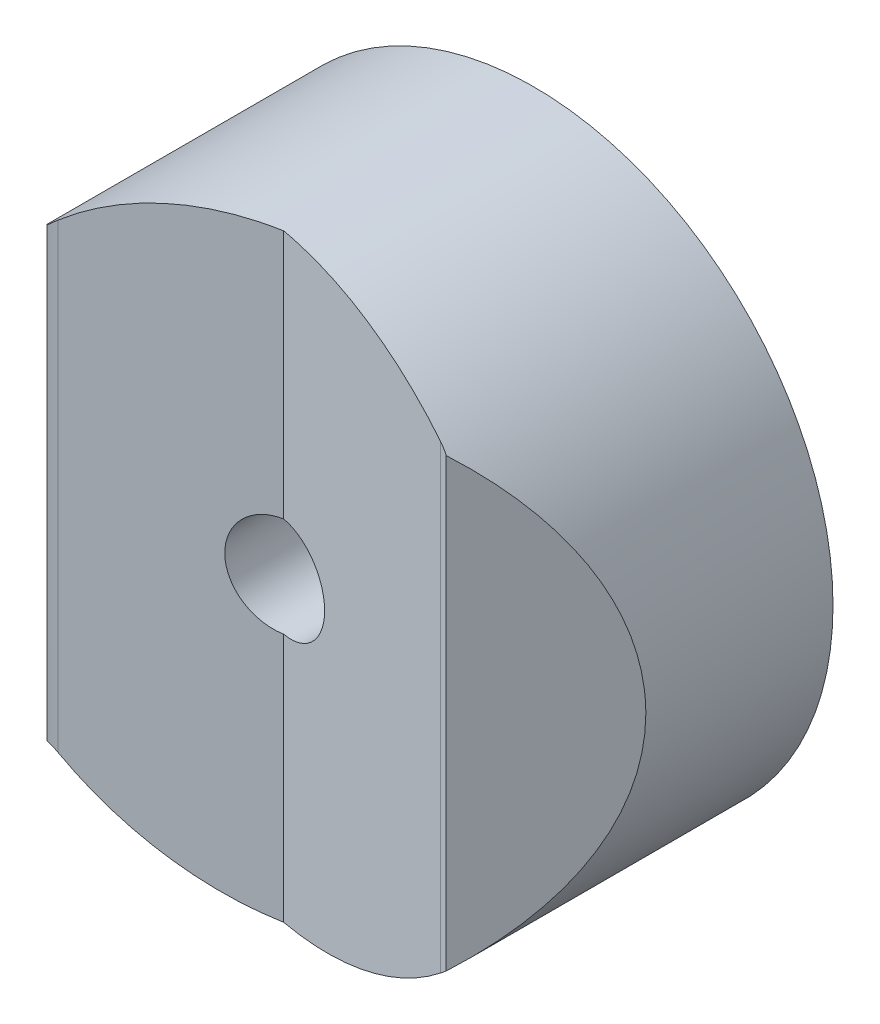
ISO-10303-21;
HEADER;
FILE_DESCRIPTION(('STEP AP214'),'2;1');
FILE_NAME('part.step','',(''),(''),'','','');
FILE_SCHEMA(('AUTOMOTIVE_DESIGN { 1 0 10303 214 1 1 1 1 }'));
ENDSEC;
DATA;
#1=APPLICATION_CONTEXT('core data for automotive mechanical design processes');
#2=APPLICATION_PROTOCOL_DEFINITION('international standard','automotive_design',2000,#1);
#3=PRODUCT_CONTEXT('',#1,'mechanical');
#4=PRODUCT('Part','Part','',(#3));
#5=PRODUCT_RELATED_PRODUCT_CATEGORY('part','',(#4));
#6=PRODUCT_DEFINITION_FORMATION('','',#4);
#7=PRODUCT_DEFINITION_CONTEXT('part definition',#1,'design');
#8=PRODUCT_DEFINITION('design','',#6,#7);
#9=PRODUCT_DEFINITION_SHAPE('','',#8);
#10=(LENGTH_UNIT() NAMED_UNIT(*) SI_UNIT(.MILLI.,.METRE.));
#11=(NAMED_UNIT(*) PLANE_ANGLE_UNIT() SI_UNIT($,.RADIAN.));
#12=(NAMED_UNIT(*) SI_UNIT($,.STERADIAN.) SOLID_ANGLE_UNIT());
#13=UNCERTAINTY_MEASURE_WITH_UNIT(LENGTH_MEASURE(1.E-05),#10,'distance_accuracy_value','');
#14=(GEOMETRIC_REPRESENTATION_CONTEXT(3) GLOBAL_UNCERTAINTY_ASSIGNED_CONTEXT((#13)) GLOBAL_UNIT_ASSIGNED_CONTEXT((#10,
#11,#12)) REPRESENTATION_CONTEXT('',''));
#15=CARTESIAN_POINT('',(0.,0.,0.));
#16=DIRECTION('',(0.,0.,1.));
#17=DIRECTION('',(1.,0.,0.));
#18=AXIS2_PLACEMENT_3D('',#15,#16,#17);
#19=CARTESIAN_POINT('',(0.,0.,-36.5125));
#20=DIRECTION('',(0.,0.,1.));
#21=DIRECTION('',(1.,0.,0.));
#22=AXIS2_PLACEMENT_3D('',#19,#20,#21);
#23=CYLINDRICAL_SURFACE('',#22,38.1);
#24=CARTESIAN_POINT('',(0.,0.,-4.7244));
#25=DIRECTION('',(-0.178203564975653,0.,-0.983993642982498));
#26=DIRECTION('',(-0.983993642982498,0.,0.178203564975653));
#27=AXIS2_PLACEMENT_3D('',#24,#25,#26);
#28=ELLIPSE('',#27,38.7197623396411,38.1);
#29=CARTESIAN_POINT('',(-24.3398216558144,-29.3118249476751,-0.31640100440601));
#30=VERTEX_POINT('',#29);
#31=CARTESIAN_POINT('',(0.,-38.1,-4.7244));
#32=VERTEX_POINT('',#31);
#33=EDGE_CURVE('E202',#30,#32,#28,.F.);
#34=ORIENTED_EDGE('',*,*,#33,.F.);
#35=CARTESIAN_POINT('',(-25.4,-28.3980633142474,0.));
#36=CARTESIAN_POINT('',(-25.3148303208988,-28.474242982255,-0.0360959573187998));
#37=CARTESIAN_POINT('',(-25.2287522942618,-28.5505422356214,-0.0697943426852845));
#38=CARTESIAN_POINT('',(-25.0550769459685,-28.7030735197751,-0.132295322936496));
#39=CARTESIAN_POINT('',(-24.9674826848927,-28.7793054189841,-0.161106743456608));
#40=CARTESIAN_POINT('',(-24.790760066233,-28.9316751507485,-0.213865306782932));
#41=CARTESIAN_POINT('',(-24.7016317050734,-29.0078129830842,-0.237812438250015));
#42=CARTESIAN_POINT('',(-24.5218198342486,-29.1599772335606,-0.280815303822845));
#43=CARTESIAN_POINT('',(-24.4311337783962,-29.2360031932328,-0.299862011549536));
#44=CARTESIAN_POINT('',(-24.3398216558144,-29.3118249476751,-0.316401004406011));
#45=B_SPLINE_CURVE_WITH_KNOTS('',3,(#35,#36,#37,#38,#39,#40,#41,#42,#43,#44),.UNSPECIFIED.,.F.,
.F.,(4,2,2,2,4),(0.,0.359472961037676,0.718289653868731,1.07710718312677,1.43658098275324),.UNSPECIFIED.);
#46=CARTESIAN_POINT('',(-25.3999999999999,-28.3980633142474,0.));
#47=VERTEX_POINT('',#46);
#48=EDGE_CURVE('E318',#47,#30,#45,.T.);
#49=ORIENTED_EDGE('',*,*,#48,.F.);
#50=CARTESIAN_POINT('',(0.,0.,25.3999999999998));
#51=DIRECTION('',(-0.707106781186546,0.,0.707106781186549));
#52=DIRECTION('',(0.707106781186549,0.,0.707106781186546));
#53=AXIS2_PLACEMENT_3D('',#50,#51,#52);
#54=ELLIPSE('',#53,53.8815367264148,38.1);
#55=CARTESIAN_POINT('',(-25.3999999999999,28.3980633142474,0.));
#56=VERTEX_POINT('',#55);
#57=EDGE_CURVE('E210',#47,#56,#54,.F.);
#58=ORIENTED_EDGE('',*,*,#57,.T.);
#59=CARTESIAN_POINT('',(-24.3398216558144,29.3118249476751,-0.31640100440601));
#60=CARTESIAN_POINT('',(-24.4311337783962,29.2360031932328,-0.299862011549535));
#61=CARTESIAN_POINT('',(-24.5218198342486,29.1599772335606,-0.280815303822845));
#62=CARTESIAN_POINT('',(-24.7016317050734,29.0078129830842,-0.237812438250015));
#63=CARTESIAN_POINT('',(-24.790760066233,28.9316751507485,-0.213865306782933));
#64=CARTESIAN_POINT('',(-24.9674826848927,28.7793054189841,-0.16110674345661));
#65=CARTESIAN_POINT('',(-25.0550769459685,28.7030735197751,-0.1322953229365));
#66=CARTESIAN_POINT('',(-25.2287522942618,28.5505422356214,-0.0697943426852912));
#67=CARTESIAN_POINT('',(-25.3148303208988,28.4742429822551,-0.0360959573188078));
#68=CARTESIAN_POINT('',(-25.3999999999999,28.3980633142474,0.));
#69=B_SPLINE_CURVE_WITH_KNOTS('',3,(#59,#60,#61,#62,#63,#64,#65,#66,#67,#68),.UNSPECIFIED.,.F.,
.F.,(4,2,2,2,4),(0.,0.359473799626457,0.718291328884486,1.07710802171553,1.43658098275319),.UNSPECIFIED.);
#70=CARTESIAN_POINT('',(-24.3398216558144,29.3118249476751,-0.31640100440601));
#71=VERTEX_POINT('',#70);
#72=EDGE_CURVE('E152',#71,#56,#69,.T.);
#73=ORIENTED_EDGE('',*,*,#72,.F.);
#74=CARTESIAN_POINT('',(0.,38.1,-4.7244));
#75=VERTEX_POINT('',#74);
#76=EDGE_CURVE('E195',#75,#71,#28,.F.);
#77=ORIENTED_EDGE('',*,*,#76,.F.);
#78=CARTESIAN_POINT('',(0.,0.,-4.7244));
#79=DIRECTION('',(-0.178203564975653,0.,0.983993642982498));
#80=DIRECTION('',(0.983993642982498,0.,0.178203564975653));
#81=AXIS2_PLACEMENT_3D('',#78,#79,#80);
#82=ELLIPSE('',#81,38.7197623396411,38.1);
#83=CARTESIAN_POINT('',(24.3398216558144,29.3118249476751,-0.316401004405997));
#84=VERTEX_POINT('',#83);
#85=EDGE_CURVE('E182',#75,#84,#82,.F.);
#86=ORIENTED_EDGE('',*,*,#85,.T.);
#87=CARTESIAN_POINT('',(24.3398216558144,29.3118249476751,-0.316401004405996));
#88=CARTESIAN_POINT('',(24.4311337783962,29.2360031932328,-0.299862011549522));
#89=CARTESIAN_POINT('',(24.5218198342486,29.1599772335606,-0.280815303822831));
#90=CARTESIAN_POINT('',(24.7016317050734,29.0078129830842,-0.237812438250002));
#91=CARTESIAN_POINT('',(24.7907600662329,28.9316751507485,-0.21386530678292));
#92=CARTESIAN_POINT('',(24.9674826848927,28.7793054189841,-0.161106743456598));
#93=CARTESIAN_POINT('',(25.0550769459685,28.7030735197751,-0.132295322936488));
#94=CARTESIAN_POINT('',(25.2287522942618,28.5505422356214,-0.0697943426852798));
#95=CARTESIAN_POINT('',(25.3148303208988,28.4742429822551,-0.036095957318797));
#96=CARTESIAN_POINT('',(25.3999999999999,28.3980633142474,0.));
#97=B_SPLINE_CURVE_WITH_KNOTS('',3,(#87,#88,#89,#90,#91,#92,#93,#94,#95,#96),.UNSPECIFIED.,.F.,
.F.,(4,2,2,2,4),(0.,0.359473799626455,0.718291328884481,1.07710802171552,1.43658098275318),.UNSPECIFIED.);
#98=CARTESIAN_POINT('',(25.3999999999999,28.3980633142473,0.));
#99=VERTEX_POINT('',#98);
#100=EDGE_CURVE('E324',#84,#99,#97,.T.);
#101=ORIENTED_EDGE('',*,*,#100,.T.);
#102=CARTESIAN_POINT('',(0.,0.,25.3999999999998));
#103=DIRECTION('',(-0.707106781186545,0.,-0.70710678118655));
#104=DIRECTION('',(-0.70710678118655,0.,0.707106781186545));
#105=AXIS2_PLACEMENT_3D('',#102,#103,#104);
#106=ELLIPSE('',#105,53.8815367264147,38.1);
#107=CARTESIAN_POINT('',(25.3999999999999,-28.3980633142474,0.));
#108=VERTEX_POINT('',#107);
#109=EDGE_CURVE('E204',#108,#99,#106,.F.);
#110=ORIENTED_EDGE('',*,*,#109,.F.);
#111=CARTESIAN_POINT('',(25.3999999999999,-28.3980633142474,0.));
#112=CARTESIAN_POINT('',(25.3148303208988,-28.4742429822551,-0.0360959573187992));
#113=CARTESIAN_POINT('',(25.2287522942618,-28.5505422356214,-0.069794342685282));
#114=CARTESIAN_POINT('',(25.0550769459685,-28.7030735197751,-0.13229532293649));
#115=CARTESIAN_POINT('',(24.9674826848927,-28.7793054189841,-0.161106743456599));
#116=CARTESIAN_POINT('',(24.7907600662329,-28.9316751507485,-0.213865306782922));
#117=CARTESIAN_POINT('',(24.7016317050734,-29.0078129830842,-0.237812438250004));
#118=CARTESIAN_POINT('',(24.5218198342486,-29.1599772335606,-0.280815303822834));
#119=CARTESIAN_POINT('',(24.4311337783962,-29.2360031932328,-0.299862011549524));
#120=CARTESIAN_POINT('',(24.3398216558144,-29.3118249476751,-0.316401004405997));
#121=B_SPLINE_CURVE_WITH_KNOTS('',3,(#111,#112,#113,#114,#115,#116,#117,#118,#119,#120),
.UNSPECIFIED.,.F.,.F.,(4,2,2,2,4),(0.,0.359472961037663,0.718289653868707,1.07710718312674,
1.43658098275319),.UNSPECIFIED.);
#122=CARTESIAN_POINT('',(24.3398216558144,-29.3118249476751,-0.316401004405997));
#123=VERTEX_POINT('',#122);
#124=EDGE_CURVE('E190',#108,#123,#121,.T.);
#125=ORIENTED_EDGE('',*,*,#124,.T.);
#126=EDGE_CURVE('E189',#123,#32,#82,.F.);
#127=ORIENTED_EDGE('',*,*,#126,.T.);
#128=EDGE_LOOP('',(#34,#49,#58,#73,#77,#86,#101,#110,#125,#127));
#129=FACE_BOUND('',#128,.T.);
#130=CARTESIAN_POINT('',(0.,0.,-36.5125));
#131=DIRECTION('',(0.,0.,1.));
#132=DIRECTION('',(1.,0.,0.));
#133=AXIS2_PLACEMENT_3D('',#130,#131,#132);
#134=CIRCLE('',#133,38.1);
#135=CARTESIAN_POINT('',(38.1,0.,-36.5125));
#136=VERTEX_POINT('',#135);
#137=EDGE_CURVE('E215',#136,#136,#134,.T.);
#138=ORIENTED_EDGE('',*,*,#137,.T.);
#139=EDGE_LOOP('',(#138));
#140=FACE_BOUND('',#139,.T.);
#141=ADVANCED_FACE('F129',(#129,#140),#23,.T.);
#142=CARTESIAN_POINT('',(0.,0.,-36.5125));
#143=DIRECTION('',(0.,0.,1.));
#144=DIRECTION('',(1.,0.,0.));
#145=AXIS2_PLACEMENT_3D('',#142,#143,#144);
#146=PLANE('',#145);
#147=CARTESIAN_POINT('',(0.,0.,-36.5125));
#148=DIRECTION('',(0.,0.,1.));
#149=DIRECTION('',(1.,0.,0.));
#150=AXIS2_PLACEMENT_3D('',#147,#148,#149);
#151=CIRCLE('',#150,6.35);
#152=CARTESIAN_POINT('',(6.35,0.,-36.5125));
#153=VERTEX_POINT('',#152);
#154=EDGE_CURVE('E212',#153,#153,#151,.T.);
#155=ORIENTED_EDGE('',*,*,#154,.T.);
#156=EDGE_LOOP('',(#155));
#157=FACE_BOUND('',#156,.T.);
#158=ORIENTED_EDGE('',*,*,#137,.F.);
#159=EDGE_LOOP('',(#158));
#160=FACE_BOUND('',#159,.T.);
#161=ADVANCED_FACE('F228',(#157,#160),#146,.F.);
#162=CARTESIAN_POINT('',(0.,0.,-36.5125));
#163=DIRECTION('',(0.,0.,1.));
#164=DIRECTION('',(1.,0.,0.));
#165=AXIS2_PLACEMENT_3D('',#162,#163,#164);
#166=CYLINDRICAL_SURFACE('',#165,6.35);
#167=CARTESIAN_POINT('',(0.,0.,-4.7244));
#168=DIRECTION('',(-0.178203564975653,0.,0.983993642982498));
#169=DIRECTION('',(0.983993642982498,0.,0.178203564975653));
#170=AXIS2_PLACEMENT_3D('',#167,#168,#169);
#171=ELLIPSE('',#170,6.45329372327352,6.35);
#172=CARTESIAN_POINT('',(0.,6.34999999999998,-4.7244));
#173=VERTEX_POINT('',#172);
#174=CARTESIAN_POINT('',(0.,-6.35000000000002,-4.7244));
#175=VERTEX_POINT('',#174);
#176=EDGE_CURVE('E137',#173,#175,#171,.F.);
#177=ORIENTED_EDGE('',*,*,#176,.F.);
#178=CARTESIAN_POINT('',(0.,0.,-4.7244));
#179=DIRECTION('',(-0.178203564975653,0.,-0.983993642982498));
#180=DIRECTION('',(-0.983993642982498,0.,0.178203564975653));
#181=AXIS2_PLACEMENT_3D('',#178,#179,#180);
#182=ELLIPSE('',#181,6.45329372327352,6.35);
#183=EDGE_CURVE('E12',#173,#175,#182,.F.);
#184=ORIENTED_EDGE('',*,*,#183,.T.);
#185=EDGE_LOOP('',(#177,#184));
#186=FACE_BOUND('',#185,.T.);
#187=ORIENTED_EDGE('',*,*,#154,.F.);
#188=EDGE_LOOP('',(#187));
#189=FACE_BOUND('',#188,.T.);
#190=ADVANCED_FACE('F224',(#186,#189),#166,.F.);
#191=CARTESIAN_POINT('',(12.6999999999999,-38.1,12.7));
#192=DIRECTION('',(-0.707106781186545,0.,-0.70710678118655));
#193=DIRECTION('',(-0.70710678118655,0.,0.707106781186545));
#194=AXIS2_PLACEMENT_3D('',#191,#192,#193);
#195=PLANE('',#194);
#196=ORIENTED_EDGE('',*,*,#109,.T.);
#197=DIRECTION('',(0.,-1.,0.));
#198=VECTOR('',#197,1.);
#199=CARTESIAN_POINT('',(25.3999999999999,0.,0.));
#200=LINE('',#199,#198);
#201=EDGE_CURVE('E218',#99,#108,#200,.T.);
#202=ORIENTED_EDGE('',*,*,#201,.T.);
#203=EDGE_LOOP('',(#196,#202));
#204=FACE_BOUND('',#203,.T.);
#205=ADVANCED_FACE('F227',(#204),#195,.F.);
#206=CARTESIAN_POINT('',(-12.6999999999999,-38.1,12.7));
#207=DIRECTION('',(-0.707106781186546,0.,0.707106781186549));
#208=DIRECTION('',(0.707106781186549,0.,0.707106781186546));
#209=AXIS2_PLACEMENT_3D('',#206,#207,#208);
#210=PLANE('',#209);
#211=DIRECTION('',(0.,-1.,0.));
#212=VECTOR('',#211,1.);
#213=CARTESIAN_POINT('',(-25.3999999999999,0.,0.));
#214=LINE('',#213,#212);
#215=EDGE_CURVE('E221',#56,#47,#214,.T.);
#216=ORIENTED_EDGE('',*,*,#215,.F.);
#217=ORIENTED_EDGE('',*,*,#57,.F.);
#218=EDGE_LOOP('',(#216,#217));
#219=FACE_BOUND('',#218,.T.);
#220=ADVANCED_FACE('F252',(#219),#210,.T.);
#221=CARTESIAN_POINT('',(-0.828429091608712,-38.1,-4.57436954146294));
#222=DIRECTION('',(-0.178203564975653,0.,-0.983993642982498));
#223=DIRECTION('',(-0.983993642982498,0.,0.178203564975653));
#224=AXIS2_PLACEMENT_3D('',#221,#222,#223);
#225=PLANE('',#224);
#226=ORIENTED_EDGE('',*,*,#33,.T.);
#227=DIRECTION('',(0.,1.,0.));
#228=VECTOR('',#227,1.);
#229=CARTESIAN_POINT('',(0.,-38.1,-4.7244));
#230=LINE('',#229,#228);
#231=EDGE_CURVE('E198',#32,#175,#230,.T.);
#232=ORIENTED_EDGE('',*,*,#231,.T.);
#233=ORIENTED_EDGE('',*,*,#183,.F.);
#234=EDGE_CURVE('E144',#173,#75,#230,.T.);
#235=ORIENTED_EDGE('',*,*,#234,.T.);
#236=ORIENTED_EDGE('',*,*,#76,.T.);
#237=DIRECTION('',(0.,1.,0.));
#238=VECTOR('',#237,1.);
#239=CARTESIAN_POINT('',(-24.3398216558144,-38.1,-0.31640100440601));
#240=LINE('',#239,#238);
#241=EDGE_CURVE('E335',#30,#71,#240,.T.);
#242=ORIENTED_EDGE('',*,*,#241,.F.);
#243=EDGE_LOOP('',(#226,#232,#233,#235,#236,#242));
#244=FACE_BOUND('',#243,.T.);
#245=ADVANCED_FACE('F193',(#244),#225,.F.);
#246=CARTESIAN_POINT('',(0.828429091608715,-38.1,-4.57436954146294));
#247=DIRECTION('',(-0.178203564975653,0.,0.983993642982498));
#248=DIRECTION('',(0.983993642982498,0.,0.178203564975653));
#249=AXIS2_PLACEMENT_3D('',#246,#247,#248);
#250=PLANE('',#249);
#251=DIRECTION('',(0.,1.,0.));
#252=VECTOR('',#251,1.);
#253=CARTESIAN_POINT('',(24.3398216558144,-38.1,-0.316401004405997));
#254=LINE('',#253,#252);
#255=EDGE_CURVE('E185',#123,#84,#254,.T.);
#256=ORIENTED_EDGE('',*,*,#255,.T.);
#257=ORIENTED_EDGE('',*,*,#85,.F.);
#258=ORIENTED_EDGE('',*,*,#234,.F.);
#259=ORIENTED_EDGE('',*,*,#176,.T.);
#260=ORIENTED_EDGE('',*,*,#231,.F.);
#261=ORIENTED_EDGE('',*,*,#126,.F.);
#262=EDGE_LOOP('',(#256,#257,#258,#259,#260,#261));
#263=FACE_BOUND('',#262,.T.);
#264=ADVANCED_FACE('F183',(#263),#250,.T.);
#265=CARTESIAN_POINT('',(23.4488056129718,-38.1,4.60355737057007));
#266=DIRECTION('',(0.,1.,0.));
#267=DIRECTION('',(0.,0.,1.));
#268=AXIS2_PLACEMENT_3D('',#265,#266,#267);
#269=CYLINDRICAL_SURFACE('',#268,4.99999);
#270=ORIENTED_EDGE('',*,*,#201,.F.);
#271=ORIENTED_EDGE('',*,*,#100,.F.);
#272=ORIENTED_EDGE('',*,*,#255,.F.);
#273=ORIENTED_EDGE('',*,*,#124,.F.);
#274=EDGE_LOOP('',(#270,#271,#272,#273));
#275=FACE_BOUND('',#274,.T.);
#276=ADVANCED_FACE('F273',(#275),#269,.F.);
#277=CARTESIAN_POINT('',(-23.4488056129718,-38.1,4.60355737057005));
#278=DIRECTION('',(0.,1.,0.));
#279=DIRECTION('',(0.,0.,1.));
#280=AXIS2_PLACEMENT_3D('',#277,#278,#279);
#281=CYLINDRICAL_SURFACE('',#280,4.99999);
#282=ORIENTED_EDGE('',*,*,#48,.T.);
#283=ORIENTED_EDGE('',*,*,#241,.T.);
#284=ORIENTED_EDGE('',*,*,#72,.T.);
#285=ORIENTED_EDGE('',*,*,#215,.T.);
#286=EDGE_LOOP('',(#282,#283,#284,#285));
#287=FACE_BOUND('',#286,.T.);
#288=ADVANCED_FACE('F280',(#287),#281,.F.);
#289=CLOSED_SHELL('',(#141,#161,#190,#205,#220,#245,#264,#276,#288));
#290=MANIFOLD_SOLID_BREP('B2',#289);
#291=ADVANCED_BREP_SHAPE_REPRESENTATION('',(#18,#290),#14);
#292=SHAPE_DEFINITION_REPRESENTATION(#9,#291);
ENDSEC;
END-ISO-10303-21;
